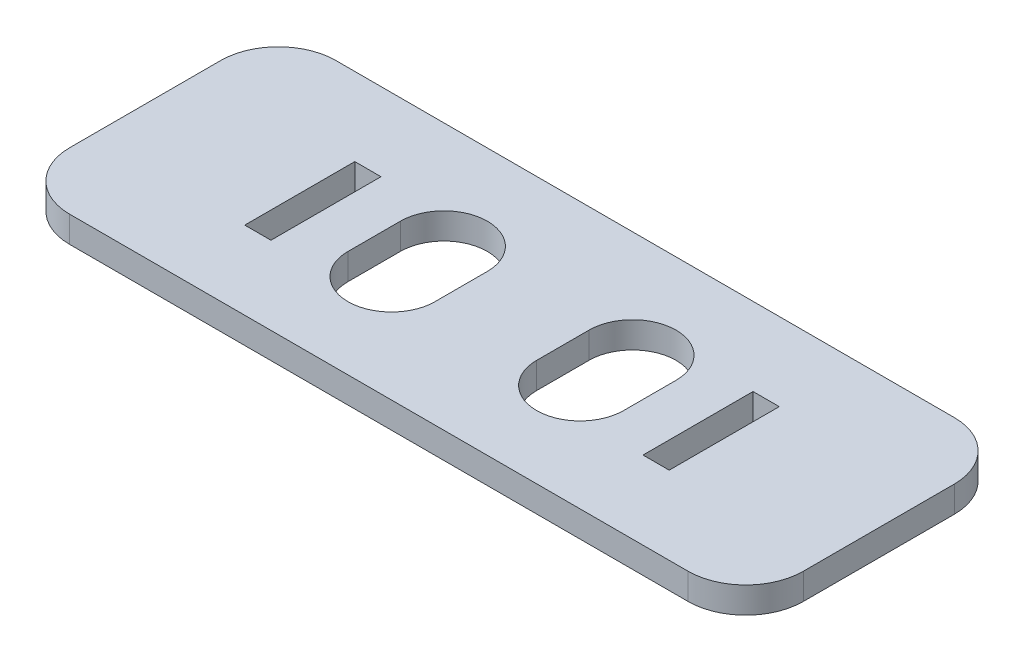
ISO-10303-21;
HEADER;
FILE_DESCRIPTION(('STEP AP214'),'2;1');
FILE_NAME('part.step','',(''),(''),'','','');
FILE_SCHEMA(('AUTOMOTIVE_DESIGN { 1 0 10303 214 1 1 1 1 }'));
ENDSEC;
DATA;
#1=APPLICATION_CONTEXT('core data for automotive mechanical design processes');
#2=APPLICATION_PROTOCOL_DEFINITION('international standard','automotive_design',2000,#1);
#3=PRODUCT_CONTEXT('',#1,'mechanical');
#4=PRODUCT('Part','Part','',(#3));
#5=PRODUCT_RELATED_PRODUCT_CATEGORY('part','',(#4));
#6=PRODUCT_DEFINITION_FORMATION('','',#4);
#7=PRODUCT_DEFINITION_CONTEXT('part definition',#1,'design');
#8=PRODUCT_DEFINITION('design','',#6,#7);
#9=PRODUCT_DEFINITION_SHAPE('','',#8);
#10=(LENGTH_UNIT() NAMED_UNIT(*) SI_UNIT(.MILLI.,.METRE.));
#11=(NAMED_UNIT(*) PLANE_ANGLE_UNIT() SI_UNIT($,.RADIAN.));
#12=(NAMED_UNIT(*) SI_UNIT($,.STERADIAN.) SOLID_ANGLE_UNIT());
#13=UNCERTAINTY_MEASURE_WITH_UNIT(LENGTH_MEASURE(1.E-05),#10,'distance_accuracy_value','');
#14=(GEOMETRIC_REPRESENTATION_CONTEXT(3) GLOBAL_UNCERTAINTY_ASSIGNED_CONTEXT((#13)) GLOBAL_UNIT_ASSIGNED_CONTEXT((#10,
#11,#12)) REPRESENTATION_CONTEXT('',''));
#15=CARTESIAN_POINT('',(0.,0.,0.));
#16=DIRECTION('',(0.,0.,1.));
#17=DIRECTION('',(1.,0.,0.));
#18=AXIS2_PLACEMENT_3D('',#15,#16,#17);
#19=CARTESIAN_POINT('',(-20.25,0.,-5.25));
#20=DIRECTION('',(0.,0.,-1.));
#21=DIRECTION('',(0.,-1.,0.));
#22=AXIS2_PLACEMENT_3D('',#19,#20,#21);
#23=PLANE('',#22);
#24=DIRECTION('',(-1.,0.,0.));
#25=VECTOR('',#24,1.);
#26=CARTESIAN_POINT('',(-20.25,2.5,-5.25));
#27=LINE('',#26,#25);
#28=CARTESIAN_POINT('',(-17.75,2.5,-5.25));
#29=VERTEX_POINT('',#28);
#30=CARTESIAN_POINT('',(-20.25,2.5,-5.25));
#31=VERTEX_POINT('',#30);
#32=EDGE_CURVE('E371',#29,#31,#27,.T.);
#33=ORIENTED_EDGE('',*,*,#32,.T.);
#34=DIRECTION('',(0.,1.,0.));
#35=VECTOR('',#34,1.);
#36=CARTESIAN_POINT('',(-20.25,0.,-5.25));
#37=LINE('',#36,#35);
#38=CARTESIAN_POINT('',(-20.25,0.,-5.25));
#39=VERTEX_POINT('',#38);
#40=EDGE_CURVE('E11',#39,#31,#37,.T.);
#41=ORIENTED_EDGE('',*,*,#40,.F.);
#42=DIRECTION('',(-1.,0.,0.));
#43=VECTOR('',#42,1.);
#44=CARTESIAN_POINT('',(-20.25,0.,-5.25));
#45=LINE('',#44,#43);
#46=CARTESIAN_POINT('',(-17.75,0.,-5.25));
#47=VERTEX_POINT('',#46);
#48=EDGE_CURVE('E424',#47,#39,#45,.T.);
#49=ORIENTED_EDGE('',*,*,#48,.F.);
#50=DIRECTION('',(0.,1.,0.));
#51=VECTOR('',#50,1.);
#52=CARTESIAN_POINT('',(-17.75,0.,-5.25));
#53=LINE('',#52,#51);
#54=EDGE_CURVE('E312',#47,#29,#53,.T.);
#55=ORIENTED_EDGE('',*,*,#54,.T.);
#56=EDGE_LOOP('',(#33,#41,#49,#55));
#57=FACE_BOUND('',#56,.T.);
#58=ADVANCED_FACE('F17',(#57),#23,.F.);
#59=CARTESIAN_POINT('',(-20.25,0.,5.25));
#60=DIRECTION('',(-1.,0.,0.));
#61=DIRECTION('',(0.,0.,1.));
#62=AXIS2_PLACEMENT_3D('',#59,#60,#61);
#63=PLANE('',#62);
#64=DIRECTION('',(0.,0.,1.));
#65=VECTOR('',#64,1.);
#66=CARTESIAN_POINT('',(-20.25,2.5,5.25));
#67=LINE('',#66,#65);
#68=CARTESIAN_POINT('',(-20.25,2.5,5.25));
#69=VERTEX_POINT('',#68);
#70=EDGE_CURVE('E368',#31,#69,#67,.T.);
#71=ORIENTED_EDGE('',*,*,#70,.T.);
#72=DIRECTION('',(0.,1.,0.));
#73=VECTOR('',#72,1.);
#74=CARTESIAN_POINT('',(-20.25,0.,5.25));
#75=LINE('',#74,#73);
#76=CARTESIAN_POINT('',(-20.25,0.,5.25));
#77=VERTEX_POINT('',#76);
#78=EDGE_CURVE('E27',#77,#69,#75,.T.);
#79=ORIENTED_EDGE('',*,*,#78,.F.);
#80=DIRECTION('',(0.,0.,1.));
#81=VECTOR('',#80,1.);
#82=CARTESIAN_POINT('',(-20.25,0.,5.25));
#83=LINE('',#82,#81);
#84=EDGE_CURVE('E327',#39,#77,#83,.T.);
#85=ORIENTED_EDGE('',*,*,#84,.F.);
#86=ORIENTED_EDGE('',*,*,#40,.T.);
#87=EDGE_LOOP('',(#71,#79,#85,#86));
#88=FACE_BOUND('',#87,.T.);
#89=ADVANCED_FACE('F19',(#88),#63,.F.);
#90=CARTESIAN_POINT('',(-20.25,0.,5.25));
#91=DIRECTION('',(0.,0.,1.));
#92=DIRECTION('',(1.,0.,0.));
#93=AXIS2_PLACEMENT_3D('',#90,#91,#92);
#94=PLANE('',#93);
#95=DIRECTION('',(1.,0.,0.));
#96=VECTOR('',#95,1.);
#97=CARTESIAN_POINT('',(-20.25,2.5,5.25));
#98=LINE('',#97,#96);
#99=CARTESIAN_POINT('',(-17.75,2.5,5.25));
#100=VERTEX_POINT('',#99);
#101=EDGE_CURVE('E359',#69,#100,#98,.T.);
#102=ORIENTED_EDGE('',*,*,#101,.T.);
#103=DIRECTION('',(0.,1.,0.));
#104=VECTOR('',#103,1.);
#105=CARTESIAN_POINT('',(-17.75,0.,5.25));
#106=LINE('',#105,#104);
#107=CARTESIAN_POINT('',(-17.75,0.,5.25));
#108=VERTEX_POINT('',#107);
#109=EDGE_CURVE('E21',#108,#100,#106,.T.);
#110=ORIENTED_EDGE('',*,*,#109,.F.);
#111=DIRECTION('',(1.,0.,0.));
#112=VECTOR('',#111,1.);
#113=CARTESIAN_POINT('',(-20.25,0.,5.25));
#114=LINE('',#113,#112);
#115=EDGE_CURVE('E419',#77,#108,#114,.T.);
#116=ORIENTED_EDGE('',*,*,#115,.F.);
#117=ORIENTED_EDGE('',*,*,#78,.T.);
#118=EDGE_LOOP('',(#102,#110,#116,#117));
#119=FACE_BOUND('',#118,.T.);
#120=ADVANCED_FACE('F507',(#119),#94,.F.);
#121=CARTESIAN_POINT('',(-17.75,0.,5.25));
#122=DIRECTION('',(1.,0.,0.));
#123=DIRECTION('',(0.,1.,0.));
#124=AXIS2_PLACEMENT_3D('',#121,#122,#123);
#125=PLANE('',#124);
#126=DIRECTION('',(0.,0.,-1.));
#127=VECTOR('',#126,1.);
#128=CARTESIAN_POINT('',(-17.75,2.5,5.25));
#129=LINE('',#128,#127);
#130=EDGE_CURVE('E350',#100,#29,#129,.T.);
#131=ORIENTED_EDGE('',*,*,#130,.T.);
#132=ORIENTED_EDGE('',*,*,#54,.F.);
#133=DIRECTION('',(0.,0.,-1.));
#134=VECTOR('',#133,1.);
#135=CARTESIAN_POINT('',(-17.75,0.,5.25));
#136=LINE('',#135,#134);
#137=EDGE_CURVE('E423',#108,#47,#136,.T.);
#138=ORIENTED_EDGE('',*,*,#137,.F.);
#139=ORIENTED_EDGE('',*,*,#109,.T.);
#140=EDGE_LOOP('',(#131,#132,#138,#139));
#141=FACE_BOUND('',#140,.T.);
#142=ADVANCED_FACE('F512',(#141),#125,.F.);
#143=CARTESIAN_POINT('',(13.15,0.,2.5));
#144=DIRECTION('',(1.,0.,0.));
#145=DIRECTION('',(0.,0.,-1.));
#146=AXIS2_PLACEMENT_3D('',#143,#144,#145);
#147=PLANE('',#146);
#148=DIRECTION('',(0.,0.,-1.));
#149=VECTOR('',#148,1.);
#150=CARTESIAN_POINT('',(13.15,2.5,2.5));
#151=LINE('',#150,#149);
#152=CARTESIAN_POINT('',(13.15,2.5,2.5));
#153=VERTEX_POINT('',#152);
#154=CARTESIAN_POINT('',(13.15,2.5,-2.5));
#155=VERTEX_POINT('',#154);
#156=EDGE_CURVE('E395',#153,#155,#151,.T.);
#157=ORIENTED_EDGE('',*,*,#156,.T.);
#158=DIRECTION('',(0.,1.,0.));
#159=VECTOR('',#158,1.);
#160=CARTESIAN_POINT('',(13.15,0.,-2.5));
#161=LINE('',#160,#159);
#162=CARTESIAN_POINT('',(13.15,0.,-2.5));
#163=VERTEX_POINT('',#162);
#164=EDGE_CURVE('E309',#163,#155,#161,.T.);
#165=ORIENTED_EDGE('',*,*,#164,.F.);
#166=DIRECTION('',(0.,0.,-1.));
#167=VECTOR('',#166,1.);
#168=CARTESIAN_POINT('',(13.15,0.,2.5));
#169=LINE('',#168,#167);
#170=CARTESIAN_POINT('',(13.15,0.,2.5));
#171=VERTEX_POINT('',#170);
#172=EDGE_CURVE('E391',#171,#163,#169,.T.);
#173=ORIENTED_EDGE('',*,*,#172,.F.);
#174=DIRECTION('',(0.,1.,0.));
#175=VECTOR('',#174,1.);
#176=CARTESIAN_POINT('',(13.15,0.,2.5));
#177=LINE('',#176,#175);
#178=EDGE_CURVE('E204',#171,#153,#177,.T.);
#179=ORIENTED_EDGE('',*,*,#178,.T.);
#180=EDGE_LOOP('',(#157,#165,#173,#179));
#181=FACE_BOUND('',#180,.T.);
#182=ADVANCED_FACE('F493',(#181),#147,.F.);
#183=CARTESIAN_POINT('',(9.,0.,-2.5));
#184=DIRECTION('',(0.,1.,0.));
#185=DIRECTION('',(0.,0.,1.));
#186=AXIS2_PLACEMENT_3D('',#183,#184,#185);
#187=CYLINDRICAL_SURFACE('',#186,4.15);
#188=CARTESIAN_POINT('',(9.,2.5,-2.5));
#189=DIRECTION('',(0.,1.,0.));
#190=DIRECTION('',(0.,0.,1.));
#191=AXIS2_PLACEMENT_3D('',#188,#189,#190);
#192=CIRCLE('',#191,4.15);
#193=CARTESIAN_POINT('',(4.85,2.5,-2.5));
#194=VERTEX_POINT('',#193);
#195=EDGE_CURVE('E382',#155,#194,#192,.T.);
#196=ORIENTED_EDGE('',*,*,#195,.T.);
#197=DIRECTION('',(0.,1.,0.));
#198=VECTOR('',#197,1.);
#199=CARTESIAN_POINT('',(4.85,0.,-2.5));
#200=LINE('',#199,#198);
#201=CARTESIAN_POINT('',(4.85,0.,-2.5));
#202=VERTEX_POINT('',#201);
#203=EDGE_CURVE('E313',#202,#194,#200,.T.);
#204=ORIENTED_EDGE('',*,*,#203,.F.);
#205=CARTESIAN_POINT('',(9.,0.,-2.5));
#206=DIRECTION('',(0.,1.,0.));
#207=DIRECTION('',(0.,0.,1.));
#208=AXIS2_PLACEMENT_3D('',#205,#206,#207);
#209=CIRCLE('',#208,4.15);
#210=EDGE_CURVE('E386',#163,#202,#209,.T.);
#211=ORIENTED_EDGE('',*,*,#210,.F.);
#212=ORIENTED_EDGE('',*,*,#164,.T.);
#213=EDGE_LOOP('',(#196,#204,#211,#212));
#214=FACE_BOUND('',#213,.T.);
#215=ADVANCED_FACE('F487',(#214),#187,.F.);
#216=CARTESIAN_POINT('',(4.85,0.,2.5));
#217=DIRECTION('',(-1.,0.,0.));
#218=DIRECTION('',(0.,0.,1.));
#219=AXIS2_PLACEMENT_3D('',#216,#217,#218);
#220=PLANE('',#219);
#221=DIRECTION('',(0.,0.,1.));
#222=VECTOR('',#221,1.);
#223=CARTESIAN_POINT('',(4.85,2.5,2.5));
#224=LINE('',#223,#222);
#225=CARTESIAN_POINT('',(4.85,2.5,2.5));
#226=VERTEX_POINT('',#225);
#227=EDGE_CURVE('E379',#194,#226,#224,.T.);
#228=ORIENTED_EDGE('',*,*,#227,.T.);
#229=DIRECTION('',(0.,1.,0.));
#230=VECTOR('',#229,1.);
#231=CARTESIAN_POINT('',(4.85,0.,2.5));
#232=LINE('',#231,#230);
#233=CARTESIAN_POINT('',(4.85,0.,2.5));
#234=VERTEX_POINT('',#233);
#235=EDGE_CURVE('E191',#234,#226,#232,.T.);
#236=ORIENTED_EDGE('',*,*,#235,.F.);
#237=DIRECTION('',(0.,0.,1.));
#238=VECTOR('',#237,1.);
#239=CARTESIAN_POINT('',(4.85,0.,2.5));
#240=LINE('',#239,#238);
#241=EDGE_CURVE('E322',#202,#234,#240,.T.);
#242=ORIENTED_EDGE('',*,*,#241,.F.);
#243=ORIENTED_EDGE('',*,*,#203,.T.);
#244=EDGE_LOOP('',(#228,#236,#242,#243));
#245=FACE_BOUND('',#244,.T.);
#246=ADVANCED_FACE('F481',(#245),#220,.F.);
#247=CARTESIAN_POINT('',(9.,0.,2.5));
#248=DIRECTION('',(0.,1.,0.));
#249=DIRECTION('',(0.,0.,1.));
#250=AXIS2_PLACEMENT_3D('',#247,#248,#249);
#251=CYLINDRICAL_SURFACE('',#250,4.15);
#252=CARTESIAN_POINT('',(9.,2.5,2.5));
#253=DIRECTION('',(0.,1.,0.));
#254=DIRECTION('',(0.,0.,1.));
#255=AXIS2_PLACEMENT_3D('',#252,#253,#254);
#256=CIRCLE('',#255,4.15);
#257=EDGE_CURVE('E374',#226,#153,#256,.T.);
#258=ORIENTED_EDGE('',*,*,#257,.T.);
#259=ORIENTED_EDGE('',*,*,#178,.F.);
#260=CARTESIAN_POINT('',(9.,0.,2.5));
#261=DIRECTION('',(0.,1.,0.));
#262=DIRECTION('',(0.,0.,1.));
#263=AXIS2_PLACEMENT_3D('',#260,#261,#262);
#264=CIRCLE('',#263,4.15);
#265=EDGE_CURVE('E326',#234,#171,#264,.T.);
#266=ORIENTED_EDGE('',*,*,#265,.F.);
#267=ORIENTED_EDGE('',*,*,#235,.T.);
#268=EDGE_LOOP('',(#258,#259,#266,#267));
#269=FACE_BOUND('',#268,.T.);
#270=ADVANCED_FACE('F491',(#269),#251,.F.);
#271=CARTESIAN_POINT('',(-4.85,0.,2.5));
#272=DIRECTION('',(1.,0.,0.));
#273=DIRECTION('',(0.,1.,0.));
#274=AXIS2_PLACEMENT_3D('',#271,#272,#273);
#275=PLANE('',#274);
#276=DIRECTION('',(0.,0.,-1.));
#277=VECTOR('',#276,1.);
#278=CARTESIAN_POINT('',(-4.85,2.5,2.5));
#279=LINE('',#278,#277);
#280=CARTESIAN_POINT('',(-4.85,2.5,2.5));
#281=VERTEX_POINT('',#280);
#282=CARTESIAN_POINT('',(-4.85,2.5,-2.5));
#283=VERTEX_POINT('',#282);
#284=EDGE_CURVE('E351',#281,#283,#279,.T.);
#285=ORIENTED_EDGE('',*,*,#284,.T.);
#286=DIRECTION('',(0.,1.,0.));
#287=VECTOR('',#286,1.);
#288=CARTESIAN_POINT('',(-4.85,0.,-2.5));
#289=LINE('',#288,#287);
#290=CARTESIAN_POINT('',(-4.85,0.,-2.5));
#291=VERTEX_POINT('',#290);
#292=EDGE_CURVE('E139',#291,#283,#289,.T.);
#293=ORIENTED_EDGE('',*,*,#292,.F.);
#294=DIRECTION('',(0.,0.,-1.));
#295=VECTOR('',#294,1.);
#296=CARTESIAN_POINT('',(-4.85,0.,2.5));
#297=LINE('',#296,#295);
#298=CARTESIAN_POINT('',(-4.85,0.,2.5));
#299=VERTEX_POINT('',#298);
#300=EDGE_CURVE('E319',#299,#291,#297,.T.);
#301=ORIENTED_EDGE('',*,*,#300,.F.);
#302=DIRECTION('',(0.,1.,0.));
#303=VECTOR('',#302,1.);
#304=CARTESIAN_POINT('',(-4.85,0.,2.5));
#305=LINE('',#304,#303);
#306=EDGE_CURVE('E362',#299,#281,#305,.T.);
#307=ORIENTED_EDGE('',*,*,#306,.T.);
#308=EDGE_LOOP('',(#285,#293,#301,#307));
#309=FACE_BOUND('',#308,.T.);
#310=ADVANCED_FACE('F974',(#309),#275,.F.);
#311=CARTESIAN_POINT('',(-9.,0.,-2.5));
#312=DIRECTION('',(0.,1.,0.));
#313=DIRECTION('',(0.,0.,1.));
#314=AXIS2_PLACEMENT_3D('',#311,#312,#313);
#315=CYLINDRICAL_SURFACE('',#314,4.15);
#316=CARTESIAN_POINT('',(-9.,2.5,-2.5));
#317=DIRECTION('',(0.,1.,0.));
#318=DIRECTION('',(0.,0.,1.));
#319=AXIS2_PLACEMENT_3D('',#316,#317,#318);
#320=CIRCLE('',#319,4.15);
#321=CARTESIAN_POINT('',(-13.15,2.5,-2.5));
#322=VERTEX_POINT('',#321);
#323=EDGE_CURVE('E355',#283,#322,#320,.T.);
#324=ORIENTED_EDGE('',*,*,#323,.T.);
#325=DIRECTION('',(0.,1.,0.));
#326=VECTOR('',#325,1.);
#327=CARTESIAN_POINT('',(-13.15,0.,-2.5));
#328=LINE('',#327,#326);
#329=CARTESIAN_POINT('',(-13.15,0.,-2.5));
#330=VERTEX_POINT('',#329);
#331=EDGE_CURVE('E471',#330,#322,#328,.T.);
#332=ORIENTED_EDGE('',*,*,#331,.F.);
#333=CARTESIAN_POINT('',(-9.,0.,-2.5));
#334=DIRECTION('',(0.,1.,0.));
#335=DIRECTION('',(0.,0.,1.));
#336=AXIS2_PLACEMENT_3D('',#333,#334,#335);
#337=CIRCLE('',#336,4.15);
#338=EDGE_CURVE('E314',#291,#330,#337,.T.);
#339=ORIENTED_EDGE('',*,*,#338,.F.);
#340=ORIENTED_EDGE('',*,*,#292,.T.);
#341=EDGE_LOOP('',(#324,#332,#339,#340));
#342=FACE_BOUND('',#341,.T.);
#343=ADVANCED_FACE('F878',(#342),#315,.F.);
#344=CARTESIAN_POINT('',(-13.15,0.,2.5));
#345=DIRECTION('',(-1.,0.,0.));
#346=DIRECTION('',(0.,0.,1.));
#347=AXIS2_PLACEMENT_3D('',#344,#345,#346);
#348=PLANE('',#347);
#349=DIRECTION('',(0.,0.,1.));
#350=VECTOR('',#349,1.);
#351=CARTESIAN_POINT('',(-13.15,2.5,2.5));
#352=LINE('',#351,#350);
#353=CARTESIAN_POINT('',(-13.15,2.5,2.5));
#354=VERTEX_POINT('',#353);
#355=EDGE_CURVE('E401',#322,#354,#352,.T.);
#356=ORIENTED_EDGE('',*,*,#355,.T.);
#357=DIRECTION('',(0.,1.,0.));
#358=VECTOR('',#357,1.);
#359=CARTESIAN_POINT('',(-13.15,0.,2.5));
#360=LINE('',#359,#358);
#361=CARTESIAN_POINT('',(-13.15,0.,2.5));
#362=VERTEX_POINT('',#361);
#363=EDGE_CURVE('E468',#362,#354,#360,.T.);
#364=ORIENTED_EDGE('',*,*,#363,.F.);
#365=DIRECTION('',(0.,0.,1.));
#366=VECTOR('',#365,1.);
#367=CARTESIAN_POINT('',(-13.15,0.,2.5));
#368=LINE('',#367,#366);
#369=EDGE_CURVE('E390',#330,#362,#368,.T.);
#370=ORIENTED_EDGE('',*,*,#369,.F.);
#371=ORIENTED_EDGE('',*,*,#331,.T.);
#372=EDGE_LOOP('',(#356,#364,#370,#371));
#373=FACE_BOUND('',#372,.T.);
#374=ADVANCED_FACE('F872',(#373),#348,.F.);
#375=CARTESIAN_POINT('',(-9.,0.,2.5));
#376=DIRECTION('',(0.,1.,0.));
#377=DIRECTION('',(0.,0.,1.));
#378=AXIS2_PLACEMENT_3D('',#375,#376,#377);
#379=CYLINDRICAL_SURFACE('',#378,4.15);
#380=CARTESIAN_POINT('',(-9.,2.5,2.5));
#381=DIRECTION('',(0.,1.,0.));
#382=DIRECTION('',(0.,0.,1.));
#383=AXIS2_PLACEMENT_3D('',#380,#381,#382);
#384=CIRCLE('',#383,4.15);
#385=EDGE_CURVE('E398',#354,#281,#384,.T.);
#386=ORIENTED_EDGE('',*,*,#385,.T.);
#387=ORIENTED_EDGE('',*,*,#306,.F.);
#388=CARTESIAN_POINT('',(-9.,0.,2.5));
#389=DIRECTION('',(0.,1.,0.));
#390=DIRECTION('',(0.,0.,1.));
#391=AXIS2_PLACEMENT_3D('',#388,#389,#390);
#392=CIRCLE('',#391,4.15);
#393=EDGE_CURVE('E439',#362,#299,#392,.T.);
#394=ORIENTED_EDGE('',*,*,#393,.F.);
#395=ORIENTED_EDGE('',*,*,#363,.T.);
#396=EDGE_LOOP('',(#386,#387,#394,#395));
#397=FACE_BOUND('',#396,.T.);
#398=ADVANCED_FACE('F877',(#397),#379,.F.);
#399=CARTESIAN_POINT('',(20.25,0.,5.25));
#400=DIRECTION('',(0.,0.,1.));
#401=DIRECTION('',(1.,0.,0.));
#402=AXIS2_PLACEMENT_3D('',#399,#400,#401);
#403=PLANE('',#402);
#404=DIRECTION('',(1.,0.,0.));
#405=VECTOR('',#404,1.);
#406=CARTESIAN_POINT('',(20.25,2.5,5.25));
#407=LINE('',#406,#405);
#408=CARTESIAN_POINT('',(17.75,2.5,5.25));
#409=VERTEX_POINT('',#408);
#410=CARTESIAN_POINT('',(20.25,2.5,5.25));
#411=VERTEX_POINT('',#410);
#412=EDGE_CURVE('E409',#409,#411,#407,.T.);
#413=ORIENTED_EDGE('',*,*,#412,.T.);
#414=DIRECTION('',(0.,1.,0.));
#415=VECTOR('',#414,1.);
#416=CARTESIAN_POINT('',(20.25,0.,5.25));
#417=LINE('',#416,#415);
#418=CARTESIAN_POINT('',(20.25,0.,5.25));
#419=VERTEX_POINT('',#418);
#420=EDGE_CURVE('E40',#419,#411,#417,.T.);
#421=ORIENTED_EDGE('',*,*,#420,.F.);
#422=DIRECTION('',(1.,0.,0.));
#423=VECTOR('',#422,1.);
#424=CARTESIAN_POINT('',(20.25,0.,5.25));
#425=LINE('',#424,#423);
#426=CARTESIAN_POINT('',(17.75,0.,5.25));
#427=VERTEX_POINT('',#426);
#428=EDGE_CURVE('E455',#427,#419,#425,.T.);
#429=ORIENTED_EDGE('',*,*,#428,.F.);
#430=DIRECTION('',(0.,1.,0.));
#431=VECTOR('',#430,1.);
#432=CARTESIAN_POINT('',(17.75,0.,5.25));
#433=LINE('',#432,#431);
#434=EDGE_CURVE('E54',#427,#409,#433,.T.);
#435=ORIENTED_EDGE('',*,*,#434,.T.);
#436=EDGE_LOOP('',(#413,#421,#429,#435));
#437=FACE_BOUND('',#436,.T.);
#438=ADVANCED_FACE('F890',(#437),#403,.F.);
#439=CARTESIAN_POINT('',(20.25,0.,5.25));
#440=DIRECTION('',(1.,0.,0.));
#441=DIRECTION('',(0.,1.,0.));
#442=AXIS2_PLACEMENT_3D('',#439,#440,#441);
#443=PLANE('',#442);
#444=DIRECTION('',(0.,0.,-1.));
#445=VECTOR('',#444,1.);
#446=CARTESIAN_POINT('',(20.25,2.5,5.25));
#447=LINE('',#446,#445);
#448=CARTESIAN_POINT('',(20.25,2.5,-5.25));
#449=VERTEX_POINT('',#448);
#450=EDGE_CURVE('E367',#411,#449,#447,.T.);
#451=ORIENTED_EDGE('',*,*,#450,.T.);
#452=DIRECTION('',(0.,1.,0.));
#453=VECTOR('',#452,1.);
#454=CARTESIAN_POINT('',(20.25,0.,-5.25));
#455=LINE('',#454,#453);
#456=CARTESIAN_POINT('',(20.25,0.,-5.25));
#457=VERTEX_POINT('',#456);
#458=EDGE_CURVE('E150',#457,#449,#455,.T.);
#459=ORIENTED_EDGE('',*,*,#458,.F.);
#460=DIRECTION('',(0.,0.,-1.));
#461=VECTOR('',#460,1.);
#462=CARTESIAN_POINT('',(20.25,0.,5.25));
#463=LINE('',#462,#461);
#464=EDGE_CURVE('E459',#419,#457,#463,.T.);
#465=ORIENTED_EDGE('',*,*,#464,.F.);
#466=ORIENTED_EDGE('',*,*,#420,.T.);
#467=EDGE_LOOP('',(#451,#459,#465,#466));
#468=FACE_BOUND('',#467,.T.);
#469=ADVANCED_FACE('F947',(#468),#443,.F.);
#470=CARTESIAN_POINT('',(20.25,0.,-5.25));
#471=DIRECTION('',(0.,0.,-1.));
#472=DIRECTION('',(-1.,0.,0.));
#473=AXIS2_PLACEMENT_3D('',#470,#471,#472);
#474=PLANE('',#473);
#475=DIRECTION('',(-1.,0.,0.));
#476=VECTOR('',#475,1.);
#477=CARTESIAN_POINT('',(20.25,2.5,-5.25));
#478=LINE('',#477,#476);
#479=CARTESIAN_POINT('',(17.75,2.5,-5.25));
#480=VERTEX_POINT('',#479);
#481=EDGE_CURVE('E363',#449,#480,#478,.T.);
#482=ORIENTED_EDGE('',*,*,#481,.T.);
#483=DIRECTION('',(0.,1.,0.));
#484=VECTOR('',#483,1.);
#485=CARTESIAN_POINT('',(17.75,0.,-5.25));
#486=LINE('',#485,#484);
#487=CARTESIAN_POINT('',(17.75,0.,-5.25));
#488=VERTEX_POINT('',#487);
#489=EDGE_CURVE('E385',#488,#480,#486,.T.);
#490=ORIENTED_EDGE('',*,*,#489,.F.);
#491=DIRECTION('',(-1.,0.,0.));
#492=VECTOR('',#491,1.);
#493=CARTESIAN_POINT('',(20.25,0.,-5.25));
#494=LINE('',#493,#492);
#495=EDGE_CURVE('E318',#457,#488,#494,.T.);
#496=ORIENTED_EDGE('',*,*,#495,.F.);
#497=ORIENTED_EDGE('',*,*,#458,.T.);
#498=EDGE_LOOP('',(#482,#490,#496,#497));
#499=FACE_BOUND('',#498,.T.);
#500=ADVANCED_FACE('F937',(#499),#474,.F.);
#501=CARTESIAN_POINT('',(17.75,0.,5.25));
#502=DIRECTION('',(-1.,0.,0.));
#503=DIRECTION('',(0.,0.,1.));
#504=AXIS2_PLACEMENT_3D('',#501,#502,#503);
#505=PLANE('',#504);
#506=DIRECTION('',(0.,0.,1.));
#507=VECTOR('',#506,1.);
#508=CARTESIAN_POINT('',(17.75,2.5,5.25));
#509=LINE('',#508,#507);
#510=EDGE_CURVE('E354',#480,#409,#509,.T.);
#511=ORIENTED_EDGE('',*,*,#510,.T.);
#512=ORIENTED_EDGE('',*,*,#434,.F.);
#513=DIRECTION('',(0.,0.,1.));
#514=VECTOR('',#513,1.);
#515=CARTESIAN_POINT('',(17.75,0.,5.25));
#516=LINE('',#515,#514);
#517=EDGE_CURVE('E451',#488,#427,#516,.T.);
#518=ORIENTED_EDGE('',*,*,#517,.F.);
#519=ORIENTED_EDGE('',*,*,#489,.T.);
#520=EDGE_LOOP('',(#511,#512,#518,#519));
#521=FACE_BOUND('',#520,.T.);
#522=ADVANCED_FACE('F927',(#521),#505,.F.);
#523=CARTESIAN_POINT('',(29.5,2.5,7.2));
#524=DIRECTION('',(0.,-1.,0.));
#525=DIRECTION('',(0.,0.,-1.));
#526=AXIS2_PLACEMENT_3D('',#523,#524,#525);
#527=CYLINDRICAL_SURFACE('',#526,5.5);
#528=CARTESIAN_POINT('',(29.5,2.5,7.2));
#529=DIRECTION('',(0.,1.,0.));
#530=DIRECTION('',(0.,0.,1.));
#531=AXIS2_PLACEMENT_3D('',#528,#529,#530);
#532=CIRCLE('',#531,5.5);
#533=CARTESIAN_POINT('',(29.5,2.5,12.7));
#534=VERTEX_POINT('',#533);
#535=CARTESIAN_POINT('',(35.,2.5,7.2));
#536=VERTEX_POINT('',#535);
#537=EDGE_CURVE('E343',#534,#536,#532,.T.);
#538=ORIENTED_EDGE('',*,*,#537,.F.);
#539=DIRECTION('',(0.,1.,0.));
#540=VECTOR('',#539,1.);
#541=CARTESIAN_POINT('',(29.5,2.5,12.7));
#542=LINE('',#541,#540);
#543=CARTESIAN_POINT('',(29.5,0.,12.7));
#544=VERTEX_POINT('',#543);
#545=EDGE_CURVE('E274',#544,#534,#542,.T.);
#546=ORIENTED_EDGE('',*,*,#545,.F.);
#547=CARTESIAN_POINT('',(29.5,0.,7.2));
#548=DIRECTION('',(0.,-1.,0.));
#549=DIRECTION('',(0.,0.,1.));
#550=AXIS2_PLACEMENT_3D('',#547,#548,#549);
#551=CIRCLE('',#550,5.5);
#552=CARTESIAN_POINT('',(35.,0.,7.2));
#553=VERTEX_POINT('',#552);
#554=EDGE_CURVE('E268',#553,#544,#551,.T.);
#555=ORIENTED_EDGE('',*,*,#554,.F.);
#556=DIRECTION('',(0.,-1.,0.));
#557=VECTOR('',#556,1.);
#558=CARTESIAN_POINT('',(35.,2.5,7.2));
#559=LINE('',#558,#557);
#560=EDGE_CURVE('E271',#536,#553,#559,.T.);
#561=ORIENTED_EDGE('',*,*,#560,.F.);
#562=EDGE_LOOP('',(#538,#546,#555,#561));
#563=FACE_BOUND('',#562,.T.);
#564=ADVANCED_FACE('F270',(#563),#527,.T.);
#565=CARTESIAN_POINT('',(29.5,2.5,-7.2));
#566=DIRECTION('',(0.,-1.,0.));
#567=DIRECTION('',(0.,0.,-1.));
#568=AXIS2_PLACEMENT_3D('',#565,#566,#567);
#569=CYLINDRICAL_SURFACE('',#568,5.5);
#570=CARTESIAN_POINT('',(29.5,2.5,-7.2));
#571=DIRECTION('',(0.,1.,0.));
#572=DIRECTION('',(0.,0.,1.));
#573=AXIS2_PLACEMENT_3D('',#570,#571,#572);
#574=CIRCLE('',#573,5.5);
#575=CARTESIAN_POINT('',(35.,2.5,-7.2));
#576=VERTEX_POINT('',#575);
#577=CARTESIAN_POINT('',(29.5,2.5,-12.7));
#578=VERTEX_POINT('',#577);
#579=EDGE_CURVE('E347',#576,#578,#574,.T.);
#580=ORIENTED_EDGE('',*,*,#579,.F.);
#581=DIRECTION('',(0.,1.,0.));
#582=VECTOR('',#581,1.);
#583=CARTESIAN_POINT('',(35.,2.5,-7.2));
#584=LINE('',#583,#582);
#585=CARTESIAN_POINT('',(35.,0.,-7.2));
#586=VERTEX_POINT('',#585);
#587=EDGE_CURVE('E298',#586,#576,#584,.T.);
#588=ORIENTED_EDGE('',*,*,#587,.F.);
#589=CARTESIAN_POINT('',(29.5,0.,-7.2));
#590=DIRECTION('',(0.,-1.,0.));
#591=DIRECTION('',(0.,0.,1.));
#592=AXIS2_PLACEMENT_3D('',#589,#590,#591);
#593=CIRCLE('',#592,5.5);
#594=CARTESIAN_POINT('',(29.5,0.,-12.7));
#595=VERTEX_POINT('',#594);
#596=EDGE_CURVE('E281',#595,#586,#593,.T.);
#597=ORIENTED_EDGE('',*,*,#596,.F.);
#598=DIRECTION('',(0.,-1.,0.));
#599=VECTOR('',#598,1.);
#600=CARTESIAN_POINT('',(29.5,2.5,-12.7));
#601=LINE('',#600,#599);
#602=EDGE_CURVE('E333',#578,#595,#601,.T.);
#603=ORIENTED_EDGE('',*,*,#602,.F.);
#604=EDGE_LOOP('',(#580,#588,#597,#603));
#605=FACE_BOUND('',#604,.T.);
#606=ADVANCED_FACE('F824',(#605),#569,.T.);
#607=CARTESIAN_POINT('',(-29.5,2.5,7.2));
#608=DIRECTION('',(0.,-1.,0.));
#609=DIRECTION('',(0.,0.,-1.));
#610=AXIS2_PLACEMENT_3D('',#607,#608,#609);
#611=CYLINDRICAL_SURFACE('',#610,5.5);
#612=CARTESIAN_POINT('',(-29.5,2.5,7.2));
#613=DIRECTION('',(0.,1.,0.));
#614=DIRECTION('',(0.,0.,1.));
#615=AXIS2_PLACEMENT_3D('',#612,#613,#614);
#616=CIRCLE('',#615,5.5);
#617=CARTESIAN_POINT('',(-35.,2.5,7.2));
#618=VERTEX_POINT('',#617);
#619=CARTESIAN_POINT('',(-29.5,2.5,12.7));
#620=VERTEX_POINT('',#619);
#621=EDGE_CURVE('E340',#618,#620,#616,.T.);
#622=ORIENTED_EDGE('',*,*,#621,.F.);
#623=DIRECTION('',(0.,1.,0.));
#624=VECTOR('',#623,1.);
#625=CARTESIAN_POINT('',(-35.,2.5,7.2));
#626=LINE('',#625,#624);
#627=CARTESIAN_POINT('',(-35.,0.,7.2));
#628=VERTEX_POINT('',#627);
#629=EDGE_CURVE('E520',#628,#618,#626,.T.);
#630=ORIENTED_EDGE('',*,*,#629,.F.);
#631=CARTESIAN_POINT('',(-29.5,0.,7.2));
#632=DIRECTION('',(0.,-1.,0.));
#633=DIRECTION('',(0.,0.,1.));
#634=AXIS2_PLACEMENT_3D('',#631,#632,#633);
#635=CIRCLE('',#634,5.5);
#636=CARTESIAN_POINT('',(-29.5,0.,12.7));
#637=VERTEX_POINT('',#636);
#638=EDGE_CURVE('E280',#637,#628,#635,.T.);
#639=ORIENTED_EDGE('',*,*,#638,.F.);
#640=DIRECTION('',(0.,-1.,0.));
#641=VECTOR('',#640,1.);
#642=CARTESIAN_POINT('',(-29.5,2.5,12.7));
#643=LINE('',#642,#641);
#644=EDGE_CURVE('E526',#620,#637,#643,.T.);
#645=ORIENTED_EDGE('',*,*,#644,.F.);
#646=EDGE_LOOP('',(#622,#630,#639,#645));
#647=FACE_BOUND('',#646,.T.);
#648=ADVANCED_FACE('F829',(#647),#611,.T.);
#649=CARTESIAN_POINT('',(-29.5,2.5,-7.2));
#650=DIRECTION('',(0.,-1.,0.));
#651=DIRECTION('',(0.,0.,-1.));
#652=AXIS2_PLACEMENT_3D('',#649,#650,#651);
#653=CYLINDRICAL_SURFACE('',#652,5.5);
#654=CARTESIAN_POINT('',(-29.5,2.5,-7.2));
#655=DIRECTION('',(0.,1.,0.));
#656=DIRECTION('',(0.,0.,1.));
#657=AXIS2_PLACEMENT_3D('',#654,#655,#656);
#658=CIRCLE('',#657,5.5);
#659=CARTESIAN_POINT('',(-29.5,2.5,-12.7));
#660=VERTEX_POINT('',#659);
#661=CARTESIAN_POINT('',(-35.,2.5,-7.2));
#662=VERTEX_POINT('',#661);
#663=EDGE_CURVE('E337',#660,#662,#658,.T.);
#664=ORIENTED_EDGE('',*,*,#663,.F.);
#665=DIRECTION('',(0.,1.,0.));
#666=VECTOR('',#665,1.);
#667=CARTESIAN_POINT('',(-29.5,2.5,-12.7));
#668=LINE('',#667,#666);
#669=CARTESIAN_POINT('',(-29.5,0.,-12.7));
#670=VERTEX_POINT('',#669);
#671=EDGE_CURVE('E328',#670,#660,#668,.T.);
#672=ORIENTED_EDGE('',*,*,#671,.F.);
#673=CARTESIAN_POINT('',(-29.5,0.,-7.2));
#674=DIRECTION('',(0.,-1.,0.));
#675=DIRECTION('',(0.,0.,1.));
#676=AXIS2_PLACEMENT_3D('',#673,#674,#675);
#677=CIRCLE('',#676,5.5);
#678=CARTESIAN_POINT('',(-35.,0.,-7.2));
#679=VERTEX_POINT('',#678);
#680=EDGE_CURVE('E412',#679,#670,#677,.T.);
#681=ORIENTED_EDGE('',*,*,#680,.F.);
#682=DIRECTION('',(0.,-1.,0.));
#683=VECTOR('',#682,1.);
#684=CARTESIAN_POINT('',(-35.,2.5,-7.2));
#685=LINE('',#684,#683);
#686=EDGE_CURVE('E551',#662,#679,#685,.T.);
#687=ORIENTED_EDGE('',*,*,#686,.F.);
#688=EDGE_LOOP('',(#664,#672,#681,#687));
#689=FACE_BOUND('',#688,.T.);
#690=ADVANCED_FACE('F499',(#689),#653,.T.);
#691=CARTESIAN_POINT('',(0.,0.,0.));
#692=DIRECTION('',(0.,1.,0.));
#693=DIRECTION('',(1.,0.,0.));
#694=AXIS2_PLACEMENT_3D('',#691,#692,#693);
#695=PLANE('',#694);
#696=ORIENTED_EDGE('',*,*,#495,.T.);
#697=ORIENTED_EDGE('',*,*,#517,.T.);
#698=ORIENTED_EDGE('',*,*,#428,.T.);
#699=ORIENTED_EDGE('',*,*,#464,.T.);
#700=EDGE_LOOP('',(#696,#697,#698,#699));
#701=FACE_BOUND('',#700,.T.);
#702=ORIENTED_EDGE('',*,*,#369,.T.);
#703=ORIENTED_EDGE('',*,*,#393,.T.);
#704=ORIENTED_EDGE('',*,*,#300,.T.);
#705=ORIENTED_EDGE('',*,*,#338,.T.);
#706=EDGE_LOOP('',(#702,#703,#704,#705));
#707=FACE_BOUND('',#706,.T.);
#708=ORIENTED_EDGE('',*,*,#241,.T.);
#709=ORIENTED_EDGE('',*,*,#265,.T.);
#710=ORIENTED_EDGE('',*,*,#172,.T.);
#711=ORIENTED_EDGE('',*,*,#210,.T.);
#712=EDGE_LOOP('',(#708,#709,#710,#711));
#713=FACE_BOUND('',#712,.T.);
#714=ORIENTED_EDGE('',*,*,#115,.T.);
#715=ORIENTED_EDGE('',*,*,#137,.T.);
#716=ORIENTED_EDGE('',*,*,#48,.T.);
#717=ORIENTED_EDGE('',*,*,#84,.T.);
#718=EDGE_LOOP('',(#714,#715,#716,#717));
#719=FACE_BOUND('',#718,.T.);
#720=DIRECTION('',(0.,0.,1.));
#721=VECTOR('',#720,1.);
#722=CARTESIAN_POINT('',(-35.,0.,12.7));
#723=LINE('',#722,#721);
#724=EDGE_CURVE('E556',#679,#628,#723,.T.);
#725=ORIENTED_EDGE('',*,*,#724,.F.);
#726=ORIENTED_EDGE('',*,*,#680,.T.);
#727=DIRECTION('',(-1.,0.,0.));
#728=VECTOR('',#727,1.);
#729=CARTESIAN_POINT('',(35.,0.,-12.7));
#730=LINE('',#729,#728);
#731=EDGE_CURVE('E291',#595,#670,#730,.T.);
#732=ORIENTED_EDGE('',*,*,#731,.F.);
#733=ORIENTED_EDGE('',*,*,#596,.T.);
#734=DIRECTION('',(0.,0.,-1.));
#735=VECTOR('',#734,1.);
#736=CARTESIAN_POINT('',(35.,0.,12.7));
#737=LINE('',#736,#735);
#738=EDGE_CURVE('E287',#553,#586,#737,.T.);
#739=ORIENTED_EDGE('',*,*,#738,.F.);
#740=ORIENTED_EDGE('',*,*,#554,.T.);
#741=DIRECTION('',(1.,0.,0.));
#742=VECTOR('',#741,1.);
#743=CARTESIAN_POINT('',(35.,0.,12.7));
#744=LINE('',#743,#742);
#745=EDGE_CURVE('E306',#637,#544,#744,.T.);
#746=ORIENTED_EDGE('',*,*,#745,.F.);
#747=ORIENTED_EDGE('',*,*,#638,.T.);
#748=EDGE_LOOP('',(#725,#726,#732,#733,#739,#740,#746,#747));
#749=FACE_BOUND('',#748,.T.);
#750=ADVANCED_FACE('F294',(#701,#707,#713,#719,#749),#695,.F.);
#751=CARTESIAN_POINT('',(0.,2.5,0.));
#752=DIRECTION('',(0.,1.,0.));
#753=DIRECTION('',(1.,0.,0.));
#754=AXIS2_PLACEMENT_3D('',#751,#752,#753);
#755=PLANE('',#754);
#756=ORIENTED_EDGE('',*,*,#510,.F.);
#757=ORIENTED_EDGE('',*,*,#481,.F.);
#758=ORIENTED_EDGE('',*,*,#450,.F.);
#759=ORIENTED_EDGE('',*,*,#412,.F.);
#760=EDGE_LOOP('',(#756,#757,#758,#759));
#761=FACE_BOUND('',#760,.T.);
#762=ORIENTED_EDGE('',*,*,#385,.F.);
#763=ORIENTED_EDGE('',*,*,#355,.F.);
#764=ORIENTED_EDGE('',*,*,#323,.F.);
#765=ORIENTED_EDGE('',*,*,#284,.F.);
#766=EDGE_LOOP('',(#762,#763,#764,#765));
#767=FACE_BOUND('',#766,.T.);
#768=ORIENTED_EDGE('',*,*,#257,.F.);
#769=ORIENTED_EDGE('',*,*,#227,.F.);
#770=ORIENTED_EDGE('',*,*,#195,.F.);
#771=ORIENTED_EDGE('',*,*,#156,.F.);
#772=EDGE_LOOP('',(#768,#769,#770,#771));
#773=FACE_BOUND('',#772,.T.);
#774=ORIENTED_EDGE('',*,*,#130,.F.);
#775=ORIENTED_EDGE('',*,*,#101,.F.);
#776=ORIENTED_EDGE('',*,*,#70,.F.);
#777=ORIENTED_EDGE('',*,*,#32,.F.);
#778=EDGE_LOOP('',(#774,#775,#776,#777));
#779=FACE_BOUND('',#778,.T.);
#780=DIRECTION('',(-1.,0.,0.));
#781=VECTOR('',#780,1.);
#782=CARTESIAN_POINT('',(35.,2.5,-12.7));
#783=LINE('',#782,#781);
#784=EDGE_CURVE('E332',#578,#660,#783,.T.);
#785=ORIENTED_EDGE('',*,*,#784,.T.);
#786=ORIENTED_EDGE('',*,*,#663,.T.);
#787=DIRECTION('',(0.,0.,1.));
#788=VECTOR('',#787,1.);
#789=CARTESIAN_POINT('',(-35.,2.5,12.7));
#790=LINE('',#789,#788);
#791=EDGE_CURVE('E557',#662,#618,#790,.T.);
#792=ORIENTED_EDGE('',*,*,#791,.T.);
#793=ORIENTED_EDGE('',*,*,#621,.T.);
#794=DIRECTION('',(1.,0.,0.));
#795=VECTOR('',#794,1.);
#796=CARTESIAN_POINT('',(35.,2.5,12.7));
#797=LINE('',#796,#795);
#798=EDGE_CURVE('E522',#620,#534,#797,.T.);
#799=ORIENTED_EDGE('',*,*,#798,.T.);
#800=ORIENTED_EDGE('',*,*,#537,.T.);
#801=DIRECTION('',(0.,0.,-1.));
#802=VECTOR('',#801,1.);
#803=CARTESIAN_POINT('',(35.,2.5,12.7));
#804=LINE('',#803,#802);
#805=EDGE_CURVE('E289',#536,#576,#804,.T.);
#806=ORIENTED_EDGE('',*,*,#805,.T.);
#807=ORIENTED_EDGE('',*,*,#579,.T.);
#808=EDGE_LOOP('',(#785,#786,#792,#793,#799,#800,#806,#807));
#809=FACE_BOUND('',#808,.T.);
#810=ADVANCED_FACE('F489',(#761,#767,#773,#779,#809),#755,.T.);
#811=CARTESIAN_POINT('',(35.,2.5,-12.7));
#812=DIRECTION('',(0.,0.,1.));
#813=DIRECTION('',(1.,0.,0.));
#814=AXIS2_PLACEMENT_3D('',#811,#812,#813);
#815=PLANE('',#814);
#816=ORIENTED_EDGE('',*,*,#731,.T.);
#817=ORIENTED_EDGE('',*,*,#671,.T.);
#818=ORIENTED_EDGE('',*,*,#784,.F.);
#819=ORIENTED_EDGE('',*,*,#602,.T.);
#820=EDGE_LOOP('',(#816,#817,#818,#819));
#821=FACE_BOUND('',#820,.T.);
#822=ADVANCED_FACE('F548',(#821),#815,.F.);
#823=CARTESIAN_POINT('',(35.,2.5,12.7));
#824=DIRECTION('',(-1.,0.,0.));
#825=DIRECTION('',(0.,0.,1.));
#826=AXIS2_PLACEMENT_3D('',#823,#824,#825);
#827=PLANE('',#826);
#828=ORIENTED_EDGE('',*,*,#738,.T.);
#829=ORIENTED_EDGE('',*,*,#587,.T.);
#830=ORIENTED_EDGE('',*,*,#805,.F.);
#831=ORIENTED_EDGE('',*,*,#560,.T.);
#832=EDGE_LOOP('',(#828,#829,#830,#831));
#833=FACE_BOUND('',#832,.T.);
#834=ADVANCED_FACE('F285',(#833),#827,.F.);
#835=CARTESIAN_POINT('',(35.,2.5,12.7));
#836=DIRECTION('',(0.,0.,-1.));
#837=DIRECTION('',(-1.,0.,0.));
#838=AXIS2_PLACEMENT_3D('',#835,#836,#837);
#839=PLANE('',#838);
#840=ORIENTED_EDGE('',*,*,#798,.F.);
#841=ORIENTED_EDGE('',*,*,#644,.T.);
#842=ORIENTED_EDGE('',*,*,#745,.T.);
#843=ORIENTED_EDGE('',*,*,#545,.T.);
#844=EDGE_LOOP('',(#840,#841,#842,#843));
#845=FACE_BOUND('',#844,.T.);
#846=ADVANCED_FACE('F812',(#845),#839,.F.);
#847=CARTESIAN_POINT('',(-35.,2.5,12.7));
#848=DIRECTION('',(1.,0.,0.));
#849=DIRECTION('',(0.,1.,0.));
#850=AXIS2_PLACEMENT_3D('',#847,#848,#849);
#851=PLANE('',#850);
#852=ORIENTED_EDGE('',*,*,#791,.F.);
#853=ORIENTED_EDGE('',*,*,#686,.T.);
#854=ORIENTED_EDGE('',*,*,#724,.T.);
#855=ORIENTED_EDGE('',*,*,#629,.T.);
#856=EDGE_LOOP('',(#852,#853,#854,#855));
#857=FACE_BOUND('',#856,.T.);
#858=ADVANCED_FACE('F560',(#857),#851,.F.);
#859=CLOSED_SHELL('',(#58,#89,#120,#142,#182,#215,#246,#270,#310,#343,#374,#398,#438,#469,#500,
#522,#564,#606,#648,#690,#750,#810,#822,#834,#846,#858));
#860=MANIFOLD_SOLID_BREP('B1',#859);
#861=ADVANCED_BREP_SHAPE_REPRESENTATION('',(#18,#860),#14);
#862=SHAPE_DEFINITION_REPRESENTATION(#9,#861);
ENDSEC;
END-ISO-10303-21;
